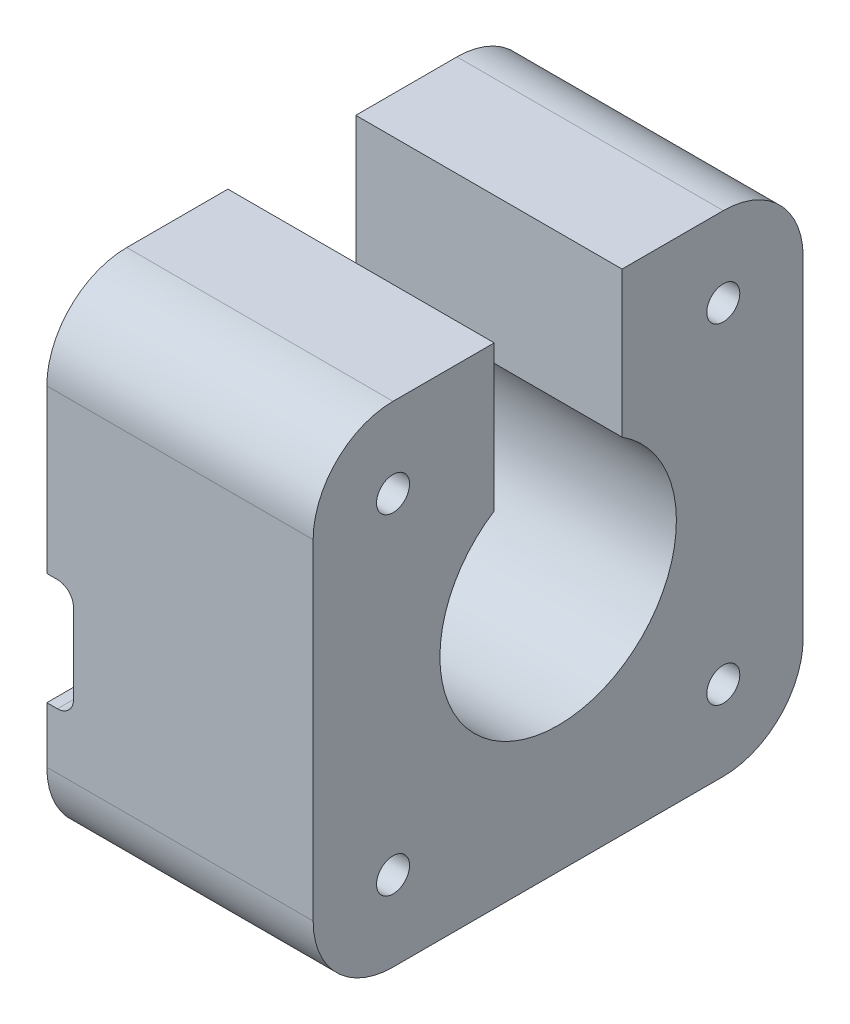
ISO-10303-21;
HEADER;
FILE_DESCRIPTION(('STEP AP214'),'2;1');
FILE_NAME('part.step','',(''),(''),'','','');
FILE_SCHEMA(('AUTOMOTIVE_DESIGN { 1 0 10303 214 1 1 1 1 }'));
ENDSEC;
DATA;
#1=APPLICATION_CONTEXT('core data for automotive mechanical design processes');
#2=APPLICATION_PROTOCOL_DEFINITION('international standard','automotive_design',2000,#1);
#3=PRODUCT_CONTEXT('',#1,'mechanical');
#4=PRODUCT('Part','Part','',(#3));
#5=PRODUCT_RELATED_PRODUCT_CATEGORY('part','',(#4));
#6=PRODUCT_DEFINITION_FORMATION('','',#4);
#7=PRODUCT_DEFINITION_CONTEXT('part definition',#1,'design');
#8=PRODUCT_DEFINITION('design','',#6,#7);
#9=PRODUCT_DEFINITION_SHAPE('','',#8);
#10=(LENGTH_UNIT() NAMED_UNIT(*) SI_UNIT(.MILLI.,.METRE.));
#11=(NAMED_UNIT(*) PLANE_ANGLE_UNIT() SI_UNIT($,.RADIAN.));
#12=(NAMED_UNIT(*) SI_UNIT($,.STERADIAN.) SOLID_ANGLE_UNIT());
#13=UNCERTAINTY_MEASURE_WITH_UNIT(LENGTH_MEASURE(1.E-05),#10,'distance_accuracy_value','');
#14=(GEOMETRIC_REPRESENTATION_CONTEXT(3) GLOBAL_UNCERTAINTY_ASSIGNED_CONTEXT((#13)) GLOBAL_UNIT_ASSIGNED_CONTEXT((#10,
#11,#12)) REPRESENTATION_CONTEXT('',''));
#15=CARTESIAN_POINT('',(0.,0.,0.));
#16=DIRECTION('',(0.,0.,1.));
#17=DIRECTION('',(1.,0.,0.));
#18=AXIS2_PLACEMENT_3D('',#15,#16,#17);
#19=CARTESIAN_POINT('',(0.,15.5,15.5));
#20=DIRECTION('',(1.,0.,0.));
#21=DIRECTION('',(0.,0.,-1.));
#22=AXIS2_PLACEMENT_3D('',#19,#20,#21);
#23=PLANE('',#22);
#24=CARTESIAN_POINT('',(0.,-15.5,-15.5));
#25=DIRECTION('',(1.,0.,0.));
#26=DIRECTION('',(0.,0.,-1.));
#27=AXIS2_PLACEMENT_3D('',#24,#25,#26);
#28=CIRCLE('',#27,1.55);
#29=CARTESIAN_POINT('',(0.,-15.5,-17.05));
#30=VERTEX_POINT('',#29);
#31=EDGE_CURVE('E409',#30,#30,#28,.T.);
#32=ORIENTED_EDGE('',*,*,#31,.T.);
#33=EDGE_LOOP('',(#32));
#34=FACE_BOUND('',#33,.T.);
#35=CARTESIAN_POINT('',(0.,-15.5,15.5));
#36=DIRECTION('',(1.,0.,0.));
#37=DIRECTION('',(0.,0.,-1.));
#38=AXIS2_PLACEMENT_3D('',#35,#36,#37);
#39=CIRCLE('',#38,1.55);
#40=CARTESIAN_POINT('',(0.,-15.5,13.95));
#41=VERTEX_POINT('',#40);
#42=EDGE_CURVE('E417',#41,#41,#39,.T.);
#43=ORIENTED_EDGE('',*,*,#42,.T.);
#44=EDGE_LOOP('',(#43));
#45=FACE_BOUND('',#44,.T.);
#46=DIRECTION('',(0.,-1.,0.));
#47=VECTOR('',#46,1.);
#48=CARTESIAN_POINT('',(0.,15.5,23.));
#49=LINE('',#48,#47);
#50=CARTESIAN_POINT('',(0.,-10.25,23.));
#51=VERTEX_POINT('',#50);
#52=CARTESIAN_POINT('',(0.,-15.5,23.));
#53=VERTEX_POINT('',#52);
#54=EDGE_CURVE('E230',#51,#53,#49,.T.);
#55=ORIENTED_EDGE('',*,*,#54,.F.);
#56=DIRECTION('',(0.,0.,-1.));
#57=VECTOR('',#56,1.);
#58=CARTESIAN_POINT('',(0.,-10.25,23.));
#59=LINE('',#58,#57);
#60=CARTESIAN_POINT('',(0.,-10.25,4.25998826289473));
#61=VERTEX_POINT('',#60);
#62=EDGE_CURVE('E444',#51,#61,#59,.T.);
#63=ORIENTED_EDGE('',*,*,#62,.T.);
#64=CARTESIAN_POINT('',(0.,0.,0.));
#65=DIRECTION('',(1.,0.,0.));
#66=DIRECTION('',(0.,0.,-1.));
#67=AXIS2_PLACEMENT_3D('',#64,#65,#66);
#68=CIRCLE('',#67,11.1);
#69=CARTESIAN_POINT('',(0.,-10.25,-4.25998826289473));
#70=VERTEX_POINT('',#69);
#71=EDGE_CURVE('E379',#61,#70,#68,.T.);
#72=ORIENTED_EDGE('',*,*,#71,.T.);
#73=CARTESIAN_POINT('',(0.,-10.25,-23.));
#74=VERTEX_POINT('',#73);
#75=EDGE_CURVE('E465',#70,#74,#59,.T.);
#76=ORIENTED_EDGE('',*,*,#75,.T.);
#77=DIRECTION('',(0.,1.,0.));
#78=VECTOR('',#77,1.);
#79=CARTESIAN_POINT('',(0.,-15.5,-23.));
#80=LINE('',#79,#78);
#81=CARTESIAN_POINT('',(0.,-15.5,-23.));
#82=VERTEX_POINT('',#81);
#83=EDGE_CURVE('E246',#82,#74,#80,.T.);
#84=ORIENTED_EDGE('',*,*,#83,.F.);
#85=CARTESIAN_POINT('',(0.,-15.5,-15.5));
#86=DIRECTION('',(1.,0.,0.));
#87=DIRECTION('',(0.,0.,-1.));
#88=AXIS2_PLACEMENT_3D('',#85,#86,#87);
#89=CIRCLE('',#88,7.5);
#90=CARTESIAN_POINT('',(0.,-23.,-15.5));
#91=VERTEX_POINT('',#90);
#92=EDGE_CURVE('E242',#91,#82,#89,.T.);
#93=ORIENTED_EDGE('',*,*,#92,.F.);
#94=DIRECTION('',(0.,0.,-1.));
#95=VECTOR('',#94,1.);
#96=CARTESIAN_POINT('',(0.,-23.,15.5));
#97=LINE('',#96,#95);
#98=CARTESIAN_POINT('',(0.,-23.,15.5));
#99=VERTEX_POINT('',#98);
#100=EDGE_CURVE('E234',#99,#91,#97,.T.);
#101=ORIENTED_EDGE('',*,*,#100,.F.);
#102=CARTESIAN_POINT('',(0.,-15.5,15.5));
#103=DIRECTION('',(1.,0.,0.));
#104=DIRECTION('',(0.,0.,-1.));
#105=AXIS2_PLACEMENT_3D('',#102,#103,#104);
#106=CIRCLE('',#105,7.5);
#107=EDGE_CURVE('E229',#53,#99,#106,.T.);
#108=ORIENTED_EDGE('',*,*,#107,.F.);
#109=EDGE_LOOP('',(#55,#63,#72,#76,#84,#93,#101,#108));
#110=FACE_BOUND('',#109,.T.);
#111=ADVANCED_FACE('F39',(#34,#45,#110),#23,.F.);
#112=CARTESIAN_POINT('',(0.,15.5,-15.5));
#113=DIRECTION('',(1.,0.,0.));
#114=DIRECTION('',(0.,0.,-1.));
#115=AXIS2_PLACEMENT_3D('',#112,#113,#114);
#116=CIRCLE('',#115,1.55);
#117=CARTESIAN_POINT('',(0.,15.5,-17.05));
#118=VERTEX_POINT('',#117);
#119=EDGE_CURVE('E401',#118,#118,#116,.T.);
#120=ORIENTED_EDGE('',*,*,#119,.T.);
#121=EDGE_LOOP('',(#120));
#122=FACE_BOUND('',#121,.T.);
#123=CARTESIAN_POINT('',(0.,0.25,-23.));
#124=VERTEX_POINT('',#123);
#125=CARTESIAN_POINT('',(0.,15.5,-23.));
#126=VERTEX_POINT('',#125);
#127=EDGE_CURVE('E245',#124,#126,#80,.T.);
#128=ORIENTED_EDGE('',*,*,#127,.F.);
#129=DIRECTION('',(0.,0.,-1.));
#130=VECTOR('',#129,1.);
#131=CARTESIAN_POINT('',(0.,0.25,23.));
#132=LINE('',#131,#130);
#133=CARTESIAN_POINT('',(0.,0.25,-11.0971843275671));
#134=VERTEX_POINT('',#133);
#135=EDGE_CURVE('E221',#134,#124,#132,.T.);
#136=ORIENTED_EDGE('',*,*,#135,.F.);
#137=CARTESIAN_POINT('',(0.,9.33862944976403,-6.));
#138=VERTEX_POINT('',#137);
#139=EDGE_CURVE('E369',#134,#138,#68,.T.);
#140=ORIENTED_EDGE('',*,*,#139,.T.);
#141=DIRECTION('',(0.,1.,0.));
#142=VECTOR('',#141,1.);
#143=CARTESIAN_POINT('',(0.,23.,-6.));
#144=LINE('',#143,#142);
#145=CARTESIAN_POINT('',(0.,23.,-6.));
#146=VERTEX_POINT('',#145);
#147=EDGE_CURVE('E429',#138,#146,#144,.T.);
#148=ORIENTED_EDGE('',*,*,#147,.T.);
#149=DIRECTION('',(0.,0.,1.));
#150=VECTOR('',#149,1.);
#151=CARTESIAN_POINT('',(0.,23.,15.5));
#152=LINE('',#151,#150);
#153=CARTESIAN_POINT('',(0.,23.,-15.5));
#154=VERTEX_POINT('',#153);
#155=EDGE_CURVE('E254',#154,#146,#152,.T.);
#156=ORIENTED_EDGE('',*,*,#155,.F.);
#157=CARTESIAN_POINT('',(0.,15.5,-15.5));
#158=DIRECTION('',(1.,0.,0.));
#159=DIRECTION('',(0.,0.,-1.));
#160=AXIS2_PLACEMENT_3D('',#157,#158,#159);
#161=CIRCLE('',#160,7.5);
#162=EDGE_CURVE('E250',#126,#154,#161,.T.);
#163=ORIENTED_EDGE('',*,*,#162,.F.);
#164=EDGE_LOOP('',(#128,#136,#140,#148,#156,#163));
#165=FACE_BOUND('',#164,.T.);
#166=ADVANCED_FACE('F367',(#122,#165),#23,.F.);
#167=CARTESIAN_POINT('',(25.,23.,15.5));
#168=DIRECTION('',(0.,-1.,0.));
#169=DIRECTION('',(0.,0.,-1.));
#170=AXIS2_PLACEMENT_3D('',#167,#168,#169);
#171=PLANE('',#170);
#172=ORIENTED_EDGE('',*,*,#155,.T.);
#173=DIRECTION('',(1.,0.,0.));
#174=VECTOR('',#173,1.);
#175=CARTESIAN_POINT('',(0.,23.,-6.));
#176=LINE('',#175,#174);
#177=CARTESIAN_POINT('',(25.,23.,-6.));
#178=VERTEX_POINT('',#177);
#179=EDGE_CURVE('E421',#146,#178,#176,.T.);
#180=ORIENTED_EDGE('',*,*,#179,.T.);
#181=DIRECTION('',(0.,0.,1.));
#182=VECTOR('',#181,1.);
#183=CARTESIAN_POINT('',(25.,23.,15.5));
#184=LINE('',#183,#182);
#185=CARTESIAN_POINT('',(25.,23.,-15.5));
#186=VERTEX_POINT('',#185);
#187=EDGE_CURVE('E264',#186,#178,#184,.T.);
#188=ORIENTED_EDGE('',*,*,#187,.F.);
#189=DIRECTION('',(-1.,0.,0.));
#190=VECTOR('',#189,1.);
#191=CARTESIAN_POINT('',(25.,23.,-15.5));
#192=LINE('',#191,#190);
#193=EDGE_CURVE('E263',#186,#154,#192,.T.);
#194=ORIENTED_EDGE('',*,*,#193,.T.);
#195=EDGE_LOOP('',(#172,#180,#188,#194));
#196=FACE_BOUND('',#195,.T.);
#197=ADVANCED_FACE('F570',(#196),#171,.F.);
#198=CARTESIAN_POINT('',(25.,15.5,15.5));
#199=DIRECTION('',(1.,0.,0.));
#200=DIRECTION('',(0.,0.,-1.));
#201=AXIS2_PLACEMENT_3D('',#198,#199,#200);
#202=PLANE('',#201);
#203=DIRECTION('',(0.,1.,0.));
#204=VECTOR('',#203,1.);
#205=CARTESIAN_POINT('',(25.,23.,-6.));
#206=LINE('',#205,#204);
#207=CARTESIAN_POINT('',(25.,9.33862944976403,-6.));
#208=VERTEX_POINT('',#207);
#209=EDGE_CURVE('E437',#208,#178,#206,.T.);
#210=ORIENTED_EDGE('',*,*,#209,.F.);
#211=CARTESIAN_POINT('',(25.,0.,0.));
#212=DIRECTION('',(1.,0.,0.));
#213=DIRECTION('',(0.,0.,-1.));
#214=AXIS2_PLACEMENT_3D('',#211,#212,#213);
#215=CIRCLE('',#214,11.1);
#216=CARTESIAN_POINT('',(25.,9.33862944976403,6.));
#217=VERTEX_POINT('',#216);
#218=EDGE_CURVE('E391',#217,#208,#215,.T.);
#219=ORIENTED_EDGE('',*,*,#218,.F.);
#220=DIRECTION('',(0.,-1.,0.));
#221=VECTOR('',#220,1.);
#222=CARTESIAN_POINT('',(25.,23.,6.));
#223=LINE('',#222,#221);
#224=CARTESIAN_POINT('',(25.,23.,6.));
#225=VERTEX_POINT('',#224);
#226=EDGE_CURVE('E441',#225,#217,#223,.T.);
#227=ORIENTED_EDGE('',*,*,#226,.F.);
#228=CARTESIAN_POINT('',(25.,23.,15.5));
#229=VERTEX_POINT('',#228);
#230=EDGE_CURVE('E537',#225,#229,#184,.T.);
#231=ORIENTED_EDGE('',*,*,#230,.T.);
#232=CARTESIAN_POINT('',(25.,15.5,15.5));
#233=DIRECTION('',(1.,0.,0.));
#234=DIRECTION('',(0.,0.,-1.));
#235=AXIS2_PLACEMENT_3D('',#232,#233,#234);
#236=CIRCLE('',#235,7.5);
#237=CARTESIAN_POINT('',(25.,15.5,23.));
#238=VERTEX_POINT('',#237);
#239=EDGE_CURVE('E258',#229,#238,#236,.T.);
#240=ORIENTED_EDGE('',*,*,#239,.T.);
#241=DIRECTION('',(0.,-1.,0.));
#242=VECTOR('',#241,1.);
#243=CARTESIAN_POINT('',(25.,15.5,23.));
#244=LINE('',#243,#242);
#245=CARTESIAN_POINT('',(25.,-15.5,23.));
#246=VERTEX_POINT('',#245);
#247=EDGE_CURVE('E529',#238,#246,#244,.T.);
#248=ORIENTED_EDGE('',*,*,#247,.T.);
#249=CARTESIAN_POINT('',(25.,-15.5,15.5));
#250=DIRECTION('',(1.,0.,0.));
#251=DIRECTION('',(0.,0.,-1.));
#252=AXIS2_PLACEMENT_3D('',#249,#250,#251);
#253=CIRCLE('',#252,7.5);
#254=CARTESIAN_POINT('',(25.,-23.,15.5));
#255=VERTEX_POINT('',#254);
#256=EDGE_CURVE('E523',#246,#255,#253,.T.);
#257=ORIENTED_EDGE('',*,*,#256,.T.);
#258=DIRECTION('',(0.,0.,-1.));
#259=VECTOR('',#258,1.);
#260=CARTESIAN_POINT('',(25.,-23.,15.5));
#261=LINE('',#260,#259);
#262=CARTESIAN_POINT('',(25.,-23.,-15.5));
#263=VERTEX_POINT('',#262);
#264=EDGE_CURVE('E518',#255,#263,#261,.T.);
#265=ORIENTED_EDGE('',*,*,#264,.T.);
#266=CARTESIAN_POINT('',(25.,-15.5,-15.5));
#267=DIRECTION('',(1.,0.,0.));
#268=DIRECTION('',(0.,0.,-1.));
#269=AXIS2_PLACEMENT_3D('',#266,#267,#268);
#270=CIRCLE('',#269,7.5);
#271=CARTESIAN_POINT('',(25.,-15.5,-23.));
#272=VERTEX_POINT('',#271);
#273=EDGE_CURVE('E522',#263,#272,#270,.T.);
#274=ORIENTED_EDGE('',*,*,#273,.T.);
#275=DIRECTION('',(0.,1.,0.));
#276=VECTOR('',#275,1.);
#277=CARTESIAN_POINT('',(25.,-15.5,-23.));
#278=LINE('',#277,#276);
#279=CARTESIAN_POINT('',(25.,15.5,-23.));
#280=VERTEX_POINT('',#279);
#281=EDGE_CURVE('E527',#272,#280,#278,.T.);
#282=ORIENTED_EDGE('',*,*,#281,.T.);
#283=CARTESIAN_POINT('',(25.,15.5,-15.5));
#284=DIRECTION('',(1.,0.,0.));
#285=DIRECTION('',(0.,0.,-1.));
#286=AXIS2_PLACEMENT_3D('',#283,#284,#285);
#287=CIRCLE('',#286,7.5);
#288=EDGE_CURVE('E535',#280,#186,#287,.T.);
#289=ORIENTED_EDGE('',*,*,#288,.T.);
#290=ORIENTED_EDGE('',*,*,#187,.T.);
#291=EDGE_LOOP('',(#210,#219,#227,#231,#240,#248,#257,#265,#274,#282,#289,#290));
#292=FACE_BOUND('',#291,.T.);
#293=CARTESIAN_POINT('',(25.,-15.5,-15.5));
#294=DIRECTION('',(1.,0.,0.));
#295=DIRECTION('',(0.,0.,-1.));
#296=AXIS2_PLACEMENT_3D('',#293,#294,#295);
#297=CIRCLE('',#296,1.55);
#298=CARTESIAN_POINT('',(25.,-15.5,-17.05));
#299=VERTEX_POINT('',#298);
#300=EDGE_CURVE('E405',#299,#299,#297,.T.);
#301=ORIENTED_EDGE('',*,*,#300,.F.);
#302=EDGE_LOOP('',(#301));
#303=FACE_BOUND('',#302,.T.);
#304=CARTESIAN_POINT('',(25.,15.5,15.5));
#305=DIRECTION('',(1.,0.,0.));
#306=DIRECTION('',(0.,0.,-1.));
#307=AXIS2_PLACEMENT_3D('',#304,#305,#306);
#308=CIRCLE('',#307,1.55);
#309=CARTESIAN_POINT('',(25.,15.5,13.95));
#310=VERTEX_POINT('',#309);
#311=EDGE_CURVE('E380',#310,#310,#308,.T.);
#312=ORIENTED_EDGE('',*,*,#311,.F.);
#313=EDGE_LOOP('',(#312));
#314=FACE_BOUND('',#313,.T.);
#315=CARTESIAN_POINT('',(25.,15.5,-15.5));
#316=DIRECTION('',(1.,0.,0.));
#317=DIRECTION('',(0.,0.,-1.));
#318=AXIS2_PLACEMENT_3D('',#315,#316,#317);
#319=CIRCLE('',#318,1.55);
#320=CARTESIAN_POINT('',(25.,15.5,-17.05));
#321=VERTEX_POINT('',#320);
#322=EDGE_CURVE('E399',#321,#321,#319,.T.);
#323=ORIENTED_EDGE('',*,*,#322,.F.);
#324=EDGE_LOOP('',(#323));
#325=FACE_BOUND('',#324,.T.);
#326=CARTESIAN_POINT('',(25.,-15.5,15.5));
#327=DIRECTION('',(1.,0.,0.));
#328=DIRECTION('',(0.,0.,-1.));
#329=AXIS2_PLACEMENT_3D('',#326,#327,#328);
#330=CIRCLE('',#329,1.55);
#331=CARTESIAN_POINT('',(25.,-15.5,13.95));
#332=VERTEX_POINT('',#331);
#333=EDGE_CURVE('E413',#332,#332,#330,.T.);
#334=ORIENTED_EDGE('',*,*,#333,.F.);
#335=EDGE_LOOP('',(#334));
#336=FACE_BOUND('',#335,.T.);
#337=ADVANCED_FACE('F547',(#292,#303,#314,#325,#336),#202,.T.);
#338=CARTESIAN_POINT('',(0.,9.33862944976403,6.));
#339=VERTEX_POINT('',#338);
#340=CARTESIAN_POINT('',(0.,0.249999999999989,11.0971843275671));
#341=VERTEX_POINT('',#340);
#342=EDGE_CURVE('E219',#339,#341,#68,.T.);
#343=ORIENTED_EDGE('',*,*,#342,.T.);
#344=CARTESIAN_POINT('',(0.,0.25,23.));
#345=VERTEX_POINT('',#344);
#346=EDGE_CURVE('E63',#345,#341,#132,.T.);
#347=ORIENTED_EDGE('',*,*,#346,.F.);
#348=CARTESIAN_POINT('',(0.,15.5,23.));
#349=VERTEX_POINT('',#348);
#350=EDGE_CURVE('E215',#349,#345,#49,.T.);
#351=ORIENTED_EDGE('',*,*,#350,.F.);
#352=CARTESIAN_POINT('',(0.,15.5,15.5));
#353=DIRECTION('',(1.,0.,0.));
#354=DIRECTION('',(0.,0.,-1.));
#355=AXIS2_PLACEMENT_3D('',#352,#353,#354);
#356=CIRCLE('',#355,7.5);
#357=CARTESIAN_POINT('',(0.,23.,15.5));
#358=VERTEX_POINT('',#357);
#359=EDGE_CURVE('E236',#358,#349,#356,.T.);
#360=ORIENTED_EDGE('',*,*,#359,.F.);
#361=CARTESIAN_POINT('',(0.,23.,6.));
#362=VERTEX_POINT('',#361);
#363=EDGE_CURVE('E253',#362,#358,#152,.T.);
#364=ORIENTED_EDGE('',*,*,#363,.F.);
#365=DIRECTION('',(0.,-1.,0.));
#366=VECTOR('',#365,1.);
#367=CARTESIAN_POINT('',(0.,23.,6.));
#368=LINE('',#367,#366);
#369=EDGE_CURVE('E440',#362,#339,#368,.T.);
#370=ORIENTED_EDGE('',*,*,#369,.T.);
#371=EDGE_LOOP('',(#343,#347,#351,#360,#364,#370));
#372=FACE_BOUND('',#371,.T.);
#373=CARTESIAN_POINT('',(0.,15.5,15.5));
#374=DIRECTION('',(1.,0.,0.));
#375=DIRECTION('',(0.,0.,-1.));
#376=AXIS2_PLACEMENT_3D('',#373,#374,#375);
#377=CIRCLE('',#376,1.55);
#378=CARTESIAN_POINT('',(0.,15.5,13.95));
#379=VERTEX_POINT('',#378);
#380=EDGE_CURVE('E386',#379,#379,#377,.T.);
#381=ORIENTED_EDGE('',*,*,#380,.T.);
#382=EDGE_LOOP('',(#381));
#383=FACE_BOUND('',#382,.T.);
#384=ADVANCED_FACE('F212',(#372,#383),#23,.F.);
#385=CARTESIAN_POINT('',(25.,15.5,15.5));
#386=DIRECTION('',(-1.,0.,0.));
#387=DIRECTION('',(0.,0.,1.));
#388=AXIS2_PLACEMENT_3D('',#385,#386,#387);
#389=CYLINDRICAL_SURFACE('',#388,7.5);
#390=ORIENTED_EDGE('',*,*,#359,.T.);
#391=DIRECTION('',(-1.,0.,0.));
#392=VECTOR('',#391,1.);
#393=CARTESIAN_POINT('',(25.,15.5,23.));
#394=LINE('',#393,#392);
#395=EDGE_CURVE('E226',#238,#349,#394,.T.);
#396=ORIENTED_EDGE('',*,*,#395,.F.);
#397=ORIENTED_EDGE('',*,*,#239,.F.);
#398=DIRECTION('',(-1.,0.,0.));
#399=VECTOR('',#398,1.);
#400=CARTESIAN_POINT('',(25.,23.,15.5));
#401=LINE('',#400,#399);
#402=EDGE_CURVE('E259',#229,#358,#401,.T.);
#403=ORIENTED_EDGE('',*,*,#402,.T.);
#404=EDGE_LOOP('',(#390,#396,#397,#403));
#405=FACE_BOUND('',#404,.T.);
#406=ADVANCED_FACE('F41',(#405),#389,.T.);
#407=CARTESIAN_POINT('',(25.,15.5,23.));
#408=DIRECTION('',(0.,0.,-1.));
#409=DIRECTION('',(-1.,0.,0.));
#410=AXIS2_PLACEMENT_3D('',#407,#408,#409);
#411=PLANE('',#410);
#412=CARTESIAN_POINT('',(1.,-8.75,23.));
#413=DIRECTION('',(0.,0.,-1.));
#414=DIRECTION('',(-1.,0.,0.));
#415=AXIS2_PLACEMENT_3D('',#412,#413,#414);
#416=CIRCLE('',#415,1.5);
#417=CARTESIAN_POINT('',(2.5,-8.75,23.));
#418=VERTEX_POINT('',#417);
#419=CARTESIAN_POINT('',(1.,-10.25,23.));
#420=VERTEX_POINT('',#419);
#421=EDGE_CURVE('E488',#418,#420,#416,.T.);
#422=ORIENTED_EDGE('',*,*,#421,.T.);
#423=DIRECTION('',(-1.,0.,0.));
#424=VECTOR('',#423,1.);
#425=CARTESIAN_POINT('',(1.,-10.25,23.));
#426=LINE('',#425,#424);
#427=EDGE_CURVE('E373',#420,#51,#426,.T.);
#428=ORIENTED_EDGE('',*,*,#427,.T.);
#429=ORIENTED_EDGE('',*,*,#54,.T.);
#430=DIRECTION('',(-1.,0.,0.));
#431=VECTOR('',#430,1.);
#432=CARTESIAN_POINT('',(25.,-15.5,23.));
#433=LINE('',#432,#431);
#434=EDGE_CURVE('E284',#246,#53,#433,.T.);
#435=ORIENTED_EDGE('',*,*,#434,.F.);
#436=ORIENTED_EDGE('',*,*,#247,.F.);
#437=ORIENTED_EDGE('',*,*,#395,.T.);
#438=ORIENTED_EDGE('',*,*,#350,.T.);
#439=DIRECTION('',(1.,0.,0.));
#440=VECTOR('',#439,1.);
#441=CARTESIAN_POINT('',(0.,0.25,23.));
#442=LINE('',#441,#440);
#443=CARTESIAN_POINT('',(1.,0.25,23.));
#444=VERTEX_POINT('',#443);
#445=EDGE_CURVE('E198',#345,#444,#442,.T.);
#446=ORIENTED_EDGE('',*,*,#445,.T.);
#447=CARTESIAN_POINT('',(1.,-1.25,23.));
#448=DIRECTION('',(0.,0.,-1.));
#449=DIRECTION('',(-1.,0.,0.));
#450=AXIS2_PLACEMENT_3D('',#447,#448,#449);
#451=CIRCLE('',#450,1.5);
#452=CARTESIAN_POINT('',(2.5,-1.25,23.));
#453=VERTEX_POINT('',#452);
#454=EDGE_CURVE('E207',#444,#453,#451,.T.);
#455=ORIENTED_EDGE('',*,*,#454,.T.);
#456=DIRECTION('',(0.,-1.,0.));
#457=VECTOR('',#456,1.);
#458=CARTESIAN_POINT('',(2.5,-1.25,23.));
#459=LINE('',#458,#457);
#460=EDGE_CURVE('E491',#453,#418,#459,.T.);
#461=ORIENTED_EDGE('',*,*,#460,.T.);
#462=EDGE_LOOP('',(#422,#428,#429,#435,#436,#437,#438,#446,#455,#461));
#463=FACE_BOUND('',#462,.T.);
#464=ADVANCED_FACE('F224',(#463),#411,.F.);
#465=CARTESIAN_POINT('',(25.,-15.5,15.5));
#466=DIRECTION('',(-1.,0.,0.));
#467=DIRECTION('',(0.,0.,1.));
#468=AXIS2_PLACEMENT_3D('',#465,#466,#467);
#469=CYLINDRICAL_SURFACE('',#468,7.5);
#470=ORIENTED_EDGE('',*,*,#107,.T.);
#471=DIRECTION('',(-1.,0.,0.));
#472=VECTOR('',#471,1.);
#473=CARTESIAN_POINT('',(25.,-23.,15.5));
#474=LINE('',#473,#472);
#475=EDGE_CURVE('E280',#255,#99,#474,.T.);
#476=ORIENTED_EDGE('',*,*,#475,.F.);
#477=ORIENTED_EDGE('',*,*,#256,.F.);
#478=ORIENTED_EDGE('',*,*,#434,.T.);
#479=EDGE_LOOP('',(#470,#476,#477,#478));
#480=FACE_BOUND('',#479,.T.);
#481=ADVANCED_FACE('F512',(#480),#469,.T.);
#482=CARTESIAN_POINT('',(25.,-23.,15.5));
#483=DIRECTION('',(0.,1.,0.));
#484=DIRECTION('',(0.,0.,1.));
#485=AXIS2_PLACEMENT_3D('',#482,#483,#484);
#486=PLANE('',#485);
#487=ORIENTED_EDGE('',*,*,#100,.T.);
#488=DIRECTION('',(-1.,0.,0.));
#489=VECTOR('',#488,1.);
#490=CARTESIAN_POINT('',(25.,-23.,-15.5));
#491=LINE('',#490,#489);
#492=EDGE_CURVE('E276',#263,#91,#491,.T.);
#493=ORIENTED_EDGE('',*,*,#492,.F.);
#494=ORIENTED_EDGE('',*,*,#264,.F.);
#495=ORIENTED_EDGE('',*,*,#475,.T.);
#496=EDGE_LOOP('',(#487,#493,#494,#495));
#497=FACE_BOUND('',#496,.T.);
#498=ADVANCED_FACE('F516',(#497),#486,.F.);
#499=CARTESIAN_POINT('',(25.,-15.5,-15.5));
#500=DIRECTION('',(-1.,0.,0.));
#501=DIRECTION('',(0.,0.,1.));
#502=AXIS2_PLACEMENT_3D('',#499,#500,#501);
#503=CYLINDRICAL_SURFACE('',#502,7.5);
#504=ORIENTED_EDGE('',*,*,#92,.T.);
#505=DIRECTION('',(-1.,0.,0.));
#506=VECTOR('',#505,1.);
#507=CARTESIAN_POINT('',(25.,-15.5,-23.));
#508=LINE('',#507,#506);
#509=EDGE_CURVE('E272',#272,#82,#508,.T.);
#510=ORIENTED_EDGE('',*,*,#509,.F.);
#511=ORIENTED_EDGE('',*,*,#273,.F.);
#512=ORIENTED_EDGE('',*,*,#492,.T.);
#513=EDGE_LOOP('',(#504,#510,#511,#512));
#514=FACE_BOUND('',#513,.T.);
#515=ADVANCED_FACE('F611',(#514),#503,.T.);
#516=CARTESIAN_POINT('',(25.,-15.5,-23.));
#517=DIRECTION('',(0.,0.,1.));
#518=DIRECTION('',(1.,0.,0.));
#519=AXIS2_PLACEMENT_3D('',#516,#517,#518);
#520=PLANE('',#519);
#521=ORIENTED_EDGE('',*,*,#83,.T.);
#522=DIRECTION('',(-1.,0.,0.));
#523=VECTOR('',#522,1.);
#524=CARTESIAN_POINT('',(1.,-10.25,-23.));
#525=LINE('',#524,#523);
#526=CARTESIAN_POINT('',(1.,-10.25,-23.));
#527=VERTEX_POINT('',#526);
#528=EDGE_CURVE('E208',#527,#74,#525,.T.);
#529=ORIENTED_EDGE('',*,*,#528,.F.);
#530=CARTESIAN_POINT('',(1.,-8.75,-23.));
#531=DIRECTION('',(0.,0.,-1.));
#532=DIRECTION('',(-1.,0.,0.));
#533=AXIS2_PLACEMENT_3D('',#530,#531,#532);
#534=CIRCLE('',#533,1.5);
#535=CARTESIAN_POINT('',(2.5,-8.75,-23.));
#536=VERTEX_POINT('',#535);
#537=EDGE_CURVE('E470',#536,#527,#534,.T.);
#538=ORIENTED_EDGE('',*,*,#537,.F.);
#539=DIRECTION('',(0.,-1.,0.));
#540=VECTOR('',#539,1.);
#541=CARTESIAN_POINT('',(2.5,-1.25,-23.));
#542=LINE('',#541,#540);
#543=CARTESIAN_POINT('',(2.5,-1.25,-23.));
#544=VERTEX_POINT('',#543);
#545=EDGE_CURVE('E474',#544,#536,#542,.T.);
#546=ORIENTED_EDGE('',*,*,#545,.F.);
#547=CARTESIAN_POINT('',(1.,-1.25,-23.));
#548=DIRECTION('',(0.,0.,-1.));
#549=DIRECTION('',(-1.,0.,0.));
#550=AXIS2_PLACEMENT_3D('',#547,#548,#549);
#551=CIRCLE('',#550,1.5);
#552=CARTESIAN_POINT('',(1.,0.25,-23.));
#553=VERTEX_POINT('',#552);
#554=EDGE_CURVE('E478',#553,#544,#551,.T.);
#555=ORIENTED_EDGE('',*,*,#554,.F.);
#556=DIRECTION('',(1.,0.,0.));
#557=VECTOR('',#556,1.);
#558=CARTESIAN_POINT('',(0.,0.25,-23.));
#559=LINE('',#558,#557);
#560=EDGE_CURVE('E482',#124,#553,#559,.T.);
#561=ORIENTED_EDGE('',*,*,#560,.F.);
#562=ORIENTED_EDGE('',*,*,#127,.T.);
#563=DIRECTION('',(-1.,0.,0.));
#564=VECTOR('',#563,1.);
#565=CARTESIAN_POINT('',(25.,15.5,-23.));
#566=LINE('',#565,#564);
#567=EDGE_CURVE('E268',#280,#126,#566,.T.);
#568=ORIENTED_EDGE('',*,*,#567,.F.);
#569=ORIENTED_EDGE('',*,*,#281,.F.);
#570=ORIENTED_EDGE('',*,*,#509,.T.);
#571=EDGE_LOOP('',(#521,#529,#538,#546,#555,#561,#562,#568,#569,#570));
#572=FACE_BOUND('',#571,.T.);
#573=ADVANCED_FACE('F561',(#572),#520,.F.);
#574=CARTESIAN_POINT('',(25.,15.5,-15.5));
#575=DIRECTION('',(-1.,0.,0.));
#576=DIRECTION('',(0.,0.,1.));
#577=AXIS2_PLACEMENT_3D('',#574,#575,#576);
#578=CYLINDRICAL_SURFACE('',#577,7.5);
#579=ORIENTED_EDGE('',*,*,#162,.T.);
#580=ORIENTED_EDGE('',*,*,#193,.F.);
#581=ORIENTED_EDGE('',*,*,#288,.F.);
#582=ORIENTED_EDGE('',*,*,#567,.T.);
#583=EDGE_LOOP('',(#579,#580,#581,#582));
#584=FACE_BOUND('',#583,.T.);
#585=ADVANCED_FACE('F566',(#584),#578,.T.);
#586=ORIENTED_EDGE('',*,*,#230,.F.);
#587=DIRECTION('',(1.,0.,0.));
#588=VECTOR('',#587,1.);
#589=CARTESIAN_POINT('',(0.,23.,6.));
#590=LINE('',#589,#588);
#591=EDGE_CURVE('E425',#362,#225,#590,.T.);
#592=ORIENTED_EDGE('',*,*,#591,.F.);
#593=ORIENTED_EDGE('',*,*,#363,.T.);
#594=ORIENTED_EDGE('',*,*,#402,.F.);
#595=EDGE_LOOP('',(#586,#592,#593,#594));
#596=FACE_BOUND('',#595,.T.);
#597=ADVANCED_FACE('F552',(#596),#171,.F.);
#598=CARTESIAN_POINT('',(25.,0.,0.));
#599=DIRECTION('',(-1.,0.,0.));
#600=DIRECTION('',(0.,0.,1.));
#601=AXIS2_PLACEMENT_3D('',#598,#599,#600);
#602=CYLINDRICAL_SURFACE('',#601,11.1);
#603=DIRECTION('',(-1.,0.,0.));
#604=VECTOR('',#603,1.);
#605=CARTESIAN_POINT('',(25.,-10.25,-4.25998826289473));
#606=LINE('',#605,#604);
#607=CARTESIAN_POINT('',(1.,-10.25,-4.25998826289463));
#608=VERTEX_POINT('',#607);
#609=EDGE_CURVE('E11',#70,#608,#606,.F.);
#610=ORIENTED_EDGE('',*,*,#609,.F.);
#611=ORIENTED_EDGE('',*,*,#71,.F.);
#612=DIRECTION('',(-1.,0.,0.));
#613=VECTOR('',#612,1.);
#614=CARTESIAN_POINT('',(25.,-10.25,4.25998826289473));
#615=LINE('',#614,#613);
#616=CARTESIAN_POINT('',(1.,-10.25,4.25998826289463));
#617=VERTEX_POINT('',#616);
#618=EDGE_CURVE('E351',#617,#61,#615,.T.);
#619=ORIENTED_EDGE('',*,*,#618,.F.);
#620=CARTESIAN_POINT('',(2.5,-8.75,6.82989751021199));
#621=CARTESIAN_POINT('',(2.49999695216573,-8.78528515917654,6.78469354066598));
#622=CARTESIAN_POINT('',(2.49875532622525,-8.82021182246697,6.73922451309262));
#623=CARTESIAN_POINT('',(2.49392046342208,-8.88929144111668,6.64783992083634));
#624=CARTESIAN_POINT('',(2.49032771584265,-8.92344455592664,6.60192445101902));
#625=CARTESIAN_POINT('',(2.47621549913724,-9.02464246699139,6.46365705644471));
#626=CARTESIAN_POINT('',(2.4623617700818,-9.09046554190688,6.37073324625371));
#627=CARTESIAN_POINT('',(2.42629254340664,-9.21927325662786,6.18289042146512));
#628=CARTESIAN_POINT('',(2.40397856969152,-9.28221428524103,6.08796084926643));
#629=CARTESIAN_POINT('',(2.35145664945438,-9.40419911362212,5.8977787727638));
#630=CARTESIAN_POINT('',(2.32124888711603,-9.46324300428066,5.80252627604575));
#631=CARTESIAN_POINT('',(2.26022108950977,-9.56522344258651,5.63242047342988));
#632=CARTESIAN_POINT('',(2.23087154926326,-9.60893230057876,5.55749838165817));
#633=CARTESIAN_POINT('',(2.16715566359952,-9.69369508450005,5.40829279072307));
#634=CARTESIAN_POINT('',(2.13279017310511,-9.7347494611439,5.33400918501566));
#635=CARTESIAN_POINT('',(2.05883409098977,-9.81385570917713,5.18701909510774));
#636=CARTESIAN_POINT('',(2.01927085903877,-9.85192174103011,5.11430652656496));
#637=CARTESIAN_POINT('',(1.93407817540708,-9.92501206075216,4.97097430408308));
#638=CARTESIAN_POINT('',(1.88845409438628,-9.96003899672543,4.90035286412772));
#639=CARTESIAN_POINT('',(1.80412015481669,-10.016953740694,4.7826345884726));
#640=CARTESIAN_POINT('',(1.76723894880198,-10.0397073077964,4.73465201988863));
#641=CARTESIAN_POINT('',(1.68891330582348,-10.0831957837829,4.64131572466507));
#642=CARTESIAN_POINT('',(1.64745928347185,-10.1039262738317,4.59596783639556));
#643=CARTESIAN_POINT('',(1.55854528747562,-10.1429908245805,4.50910482665405));
#644=CARTESIAN_POINT('',(1.51102046079557,-10.1612938614913,4.46764100722024));
#645=CARTESIAN_POINT('',(1.40912533080726,-10.1941101213306,4.39224210856417));
#646=CARTESIAN_POINT('',(1.35478544305242,-10.2086393527371,4.35827532231768));
#647=CARTESIAN_POINT('',(1.26438910572748,-10.2268853873044,4.31521804802346));
#648=CARTESIAN_POINT('',(1.23082806955519,-10.2325454636162,4.30176135243941));
#649=CARTESIAN_POINT('',(1.16181524941657,-10.241648760836,4.28004328585147));
#650=CARTESIAN_POINT('',(1.12637003116729,-10.2450991952354,4.27176501169455));
#651=CARTESIAN_POINT('',(1.07549292511016,-10.2481745568072,4.26437838213682));
#652=CARTESIAN_POINT('',(1.06046378664187,-10.2488567722752,4.26273818967452));
#653=CARTESIAN_POINT('',(1.03029255957274,-10.249770127853,4.26054141657713));
#654=CARTESIAN_POINT('',(1.0151503449513,-10.250000651941,4.25998631580458));
#655=CARTESIAN_POINT('',(0.999999999999761,-10.2500000000001,4.25998826289634));
#656=B_SPLINE_CURVE_WITH_KNOTS('',3,(#620,#621,#622,#623,#624,#625,#626,#627,#628,#629,#630,
#631,#632,#633,#634,#635,#636,#637,#638,#639,#640,#641,#642,#643,#644,#645,#646,#647,#648,#649,
#650,#651,#652,#653,#654,#655),.UNSPECIFIED.,.F.,.F.,(4,2,2,2,2,2,2,2,2,2,2,2,2,2,2,2,2,4),(0.,
0.171999591995628,0.343963401166987,0.687697979288758,1.03556292967123,1.38341976413783,
1.65797192937961,1.93247735424332,2.20559177313197,2.47846577349229,2.672251114816,
2.86645067179867,3.06293231879775,3.25856635204477,3.3679896048114,3.47705379373688,
3.52241567534464,3.56783937904874),.UNSPECIFIED.);
#657=CARTESIAN_POINT('',(2.5,-8.75,6.82989751021199));
#658=VERTEX_POINT('',#657);
#659=EDGE_CURVE('E345',#658,#617,#656,.T.);
#660=ORIENTED_EDGE('',*,*,#659,.F.);
#661=CARTESIAN_POINT('',(2.5,0.,0.));
#662=DIRECTION('',(1.,0.,0.));
#663=DIRECTION('',(0.,0.,-1.));
#664=AXIS2_PLACEMENT_3D('',#661,#662,#663);
#665=CIRCLE('',#664,11.1);
#666=CARTESIAN_POINT('',(2.5,-1.25,11.0293925490029));
#667=VERTEX_POINT('',#666);
#668=EDGE_CURVE('E302',#667,#658,#665,.T.);
#669=ORIENTED_EDGE('',*,*,#668,.F.);
#670=CARTESIAN_POINT('',(1.,0.25,11.0971843275671));
#671=CARTESIAN_POINT('',(1.04220060914268,0.249999727878121,11.0971829460123));
#672=CARTESIAN_POINT('',(1.08438098532178,0.248217992844381,11.0972246288));
#673=CARTESIAN_POINT('',(1.16843968826563,0.241109976251942,11.0973818813861));
#674=CARTESIAN_POINT('',(1.21031803015039,0.235783873389023,11.0974974474596));
#675=CARTESIAN_POINT('',(1.33497680070952,0.214539701182118,11.0979361341235));
#676=CARTESIAN_POINT('',(1.41692192914977,0.193355627437189,11.0983513196999));
#677=CARTESIAN_POINT('',(1.57609010116996,0.137532416743666,11.0991826220091));
#678=CARTESIAN_POINT('',(1.65331088468049,0.102886897365642,11.0995987390904));
#679=CARTESIAN_POINT('',(1.80084068254252,0.0211259115116074,11.1000548803991));
#680=CARTESIAN_POINT('',(1.87115080156287,-0.0259875575038661,11.1000949648323));
#681=CARTESIAN_POINT('',(2.00284230414154,-0.131332387653525,11.0993476056332));
#682=CARTESIAN_POINT('',(2.0642260122222,-0.189560845171833,11.0985603778817));
#683=CARTESIAN_POINT('',(2.17634747309456,-0.315487913187399,11.0956939630473));
#684=CARTESIAN_POINT('',(2.22708386055367,-0.383187736368722,11.0936146104072));
#685=CARTESIAN_POINT('',(2.3163156085728,-0.525863116620007,11.0877655680937));
#686=CARTESIAN_POINT('',(2.35484769450033,-0.60081594170228,11.0840010336255));
#687=CARTESIAN_POINT('',(2.41879730958748,-0.755989674210383,11.0744979804946));
#688=CARTESIAN_POINT('',(2.44422147772146,-0.836207891534179,11.0687604635791));
#689=CARTESIAN_POINT('',(2.47515627056662,-0.972418132698317,11.0574593596341));
#690=CARTESIAN_POINT('',(2.48447443564116,-1.02762464445005,11.0524687657396));
#691=CARTESIAN_POINT('',(2.49689602495519,-1.13856377766776,11.0415944104597));
#692=CARTESIAN_POINT('',(2.5000084536153,-1.19429551880119,11.0357119565138));
#693=CARTESIAN_POINT('',(2.5,-1.25,11.0293925490029));
#694=B_SPLINE_CURVE_WITH_KNOTS('',3,(#670,#671,#672,#673,#674,#675,#676,#677,#678,#679,#680,
#681,#682,#683,#684,#685,#686,#687,#688,#689,#690,#691,#692,#693),.UNSPECIFIED.,.F.,.F.,(4,2,2,
2,2,2,2,2,2,2,2,4),(0.,0.126524026409575,0.253041674362418,0.505659489526935,0.758397223958112,
1.0110944923651,1.2637258377048,1.51638955882584,1.76828557329783,2.02005388036803,
2.18835112832694,2.3564040015435),.UNSPECIFIED.);
#695=CARTESIAN_POINT('',(1.,0.25,11.0971843275671));
#696=VERTEX_POINT('',#695);
#697=EDGE_CURVE('E293',#696,#667,#694,.T.);
#698=ORIENTED_EDGE('',*,*,#697,.F.);
#699=DIRECTION('',(-1.,0.,0.));
#700=VECTOR('',#699,1.);
#701=CARTESIAN_POINT('',(25.,0.249999999999989,11.0971843275671));
#702=LINE('',#701,#700);
#703=EDGE_CURVE('E290',#341,#696,#702,.F.);
#704=ORIENTED_EDGE('',*,*,#703,.F.);
#705=ORIENTED_EDGE('',*,*,#342,.F.);
#706=DIRECTION('',(1.,0.,0.));
#707=VECTOR('',#706,1.);
#708=CARTESIAN_POINT('',(0.,9.33862944976403,6.));
#709=LINE('',#708,#707);
#710=EDGE_CURVE('E428',#339,#217,#709,.T.);
#711=ORIENTED_EDGE('',*,*,#710,.T.);
#712=ORIENTED_EDGE('',*,*,#218,.T.);
#713=DIRECTION('',(1.,0.,0.));
#714=VECTOR('',#713,1.);
#715=CARTESIAN_POINT('',(0.,9.33862944976403,-6.));
#716=LINE('',#715,#714);
#717=EDGE_CURVE('E377',#138,#208,#716,.T.);
#718=ORIENTED_EDGE('',*,*,#717,.F.);
#719=ORIENTED_EDGE('',*,*,#139,.F.);
#720=DIRECTION('',(-1.,0.,0.));
#721=VECTOR('',#720,1.);
#722=CARTESIAN_POINT('',(25.,0.249999999999989,-11.0971843275671));
#723=LINE('',#722,#721);
#724=CARTESIAN_POINT('',(0.999999999999997,0.249999999999989,-11.0971843275671));
#725=VERTEX_POINT('',#724);
#726=EDGE_CURVE('E329',#725,#134,#723,.T.);
#727=ORIENTED_EDGE('',*,*,#726,.F.);
#728=CARTESIAN_POINT('',(2.5,-1.25,-11.0293925490029));
#729=CARTESIAN_POINT('',(2.49999979678307,-1.20822206162224,-11.0341286979443));
#730=CARTESIAN_POINT('',(2.49825342869667,-1.16643598886744,-11.0386224197701));
#731=CARTESIAN_POINT('',(2.49127337954302,-1.08310550598426,-11.0471096953993));
#732=CARTESIAN_POINT('',(2.48603972200213,-1.04156109422747,-11.0511032525768));
#733=CARTESIAN_POINT('',(2.46513826012706,-0.917812302641948,-11.0622985025399));
#734=CARTESIAN_POINT('',(2.44426991406796,-0.83635317582063,-11.0687304589418));
#735=CARTESIAN_POINT('',(2.38916601817644,-0.677928388581296,-11.0795640887791));
#736=CARTESIAN_POINT('',(2.35492136503784,-0.600965829415228,-11.0839643750926));
#737=CARTESIAN_POINT('',(2.27401010214389,-0.453793933431816,-11.0909647542321));
#738=CARTESIAN_POINT('',(2.22734623057774,-0.383583112630848,-11.0935652434228));
#739=CARTESIAN_POINT('',(2.12304267584168,-0.252101457722808,-11.09733165378));
#740=CARTESIAN_POINT('',(2.06543057104517,-0.190808829572137,-11.0985011257329));
#741=CARTESIAN_POINT('',(1.94076460002665,-0.0786798085682039,-11.099863135603));
#742=CARTESIAN_POINT('',(1.87370859566747,-0.0278457900180548,-11.1000554519217));
#743=CARTESIAN_POINT('',(1.73179694352402,0.0620817854890878,-11.0999181512733));
#744=CARTESIAN_POINT('',(1.65691327264865,0.101131070083629,-11.0995865946145));
#745=CARTESIAN_POINT('',(1.50167772128682,0.166117909926795,-11.0988047429576));
#746=CARTESIAN_POINT('',(1.42132881427999,0.192062531320567,-11.0983545121493));
#747=CARTESIAN_POINT('',(1.28378983520596,0.224018712048376,-11.0977467848076));
#748=CARTESIAN_POINT('',(1.22743646312374,0.233754436303155,-11.0975417139546));
#749=CARTESIAN_POINT('',(1.11406310936223,0.246745191889367,-11.0972576811579));
#750=CARTESIAN_POINT('',(1.05704410788262,0.250008777274014,-11.0971785527868));
#751=CARTESIAN_POINT('',(1.,0.25,-11.0971843275671));
#752=B_SPLINE_CURVE_WITH_KNOTS('',3,(#728,#729,#730,#731,#732,#733,#734,#735,#736,#737,#738,
#739,#740,#741,#742,#743,#744,#745,#746,#747,#748,#749,#750,#751),.UNSPECIFIED.,.F.,.F.,(4,2,2,
2,2,2,2,2,2,2,2,4),(0.,0.126060932803525,0.252121015168952,0.503826294433472,0.75570317215436,
1.00752456200285,1.2587198314442,1.50997206421357,1.7621567655046,2.01420534112176,
2.18542216422312,2.35641254340319),.UNSPECIFIED.);
#753=CARTESIAN_POINT('',(2.5,-1.25,-11.0293925490029));
#754=VERTEX_POINT('',#753);
#755=EDGE_CURVE('E321',#754,#725,#752,.T.);
#756=ORIENTED_EDGE('',*,*,#755,.F.);
#757=CARTESIAN_POINT('',(2.5,-8.75,-6.82989751021199));
#758=VERTEX_POINT('',#757);
#759=EDGE_CURVE('E328',#758,#754,#665,.T.);
#760=ORIENTED_EDGE('',*,*,#759,.F.);
#761=CARTESIAN_POINT('',(1.,-10.25,-4.25998826289463));
#762=CARTESIAN_POINT('',(1.03710990561362,-10.2500411564709,-4.25987571483697));
#763=CARTESIAN_POINT('',(1.07404661119869,-10.2486251333345,-4.26329721397663));
#764=CARTESIAN_POINT('',(1.14614980983656,-10.2432830880877,-4.27612294334296));
#765=CARTESIAN_POINT('',(1.18133419684342,-10.239393728829,-4.28543977576924));
#766=CARTESIAN_POINT('',(1.25951651963577,-10.2280561909525,-4.31243781933709));
#767=CARTESIAN_POINT('',(1.30182970651662,-10.2199039148995,-4.33175918891394));
#768=CARTESIAN_POINT('',(1.38281430066412,-10.2009286124723,-4.37626004697047));
#769=CARTESIAN_POINT('',(1.42146025373935,-10.1900885737802,-4.4014767900624));
#770=CARTESIAN_POINT('',(1.52392252001411,-10.1572233655411,-4.47700233424046));
#771=CARTESIAN_POINT('',(1.58387681021978,-10.1330660550607,-4.53154808739734));
#772=CARTESIAN_POINT('',(1.69506720494311,-10.0806587209899,-4.64697744393696));
#773=CARTESIAN_POINT('',(1.74628396924909,-10.0523998680491,-4.70787463832867));
#774=CARTESIAN_POINT('',(1.84543438185257,-9.99052141950233,-4.83787475720781));
#775=CARTESIAN_POINT('',(1.89285281505492,-9.95666078318322,-4.90725200902079));
#776=CARTESIAN_POINT('',(1.98138711155539,-9.88582180782202,-5.04844408242662));
#777=CARTESIAN_POINT('',(2.02249629411043,-9.84884022740042,-5.12026139083309));
#778=CARTESIAN_POINT('',(2.099297234455,-9.77200682508882,-5.26541918232213));
#779=CARTESIAN_POINT('',(2.13497957305254,-9.73215018585504,-5.33876206811748));
#780=CARTESIAN_POINT('',(2.20132372088248,-9.64978682766223,-5.48623297149923));
#781=CARTESIAN_POINT('',(2.23198460303349,-9.60727962134061,-5.56036113138243));
#782=CARTESIAN_POINT('',(2.29202929167211,-9.51426171252266,-5.71823686355192));
#783=CARTESIAN_POINT('',(2.32077503883051,-9.46341455718336,-5.80202925891016));
#784=CARTESIAN_POINT('',(2.37221600435514,-9.35862902825452,-5.96957535855766));
#785=CARTESIAN_POINT('',(2.39490939689068,-9.30468972779764,-6.05332904357958));
#786=CARTESIAN_POINT('',(2.43396414376206,-9.19404673741739,-6.22008732210761));
#787=CARTESIAN_POINT('',(2.45034557712194,-9.13735247045189,-6.30309345674711));
#788=CARTESIAN_POINT('',(2.47647607536284,-9.02121796307196,-6.46821500462384));
#789=CARTESIAN_POINT('',(2.48622717580734,-8.96177857142219,-6.55033068361233));
#790=CARTESIAN_POINT('',(2.49487918485069,-8.87631704375348,-6.66503709682694));
#791=CARTESIAN_POINT('',(2.49678630380787,-8.85132687500209,-6.69818915395006));
#792=CARTESIAN_POINT('',(2.49934631519747,-8.80095355721756,-6.764239881789));
#793=CARTESIAN_POINT('',(2.49999925508587,-8.77557042309018,-6.79713856204524));
#794=CARTESIAN_POINT('',(2.5,-8.75,-6.829897510212));
#795=B_SPLINE_CURVE_WITH_KNOTS('',3,(#761,#762,#763,#764,#765,#766,#767,#768,#769,#770,#771,
#772,#773,#774,#775,#776,#777,#778,#779,#780,#781,#782,#783,#784,#785,#786,#787,#788,#789,#790,
#791,#792,#793,#794),.UNSPECIFIED.,.F.,.F.,(4,2,2,2,2,2,2,2,2,2,2,2,2,2,2,2,4),(0.,
0.110867330856398,0.220128382784784,0.361002743746432,0.50279261638207,0.755108725620931,
1.00797627875722,1.27936450692349,1.55103814909024,1.82317807309307,2.09536818415587,
2.40156222613095,2.70784853430026,3.01315230623389,3.31836230517741,3.44302338454675,
3.56767974686148),.UNSPECIFIED.);
#796=EDGE_CURVE('E48',#608,#758,#795,.T.);
#797=ORIENTED_EDGE('',*,*,#796,.F.);
#798=EDGE_LOOP('',(#610,#611,#619,#660,#669,#698,#704,#705,#711,#712,#718,#719,#727,#756,#760,#797));
#799=FACE_BOUND('',#798,.T.);
#800=ADVANCED_FACE('F304',(#799),#602,.F.);
#801=CARTESIAN_POINT('',(25.,15.5,15.5));
#802=DIRECTION('',(-1.,0.,0.));
#803=DIRECTION('',(0.,0.,1.));
#804=AXIS2_PLACEMENT_3D('',#801,#802,#803);
#805=CYLINDRICAL_SURFACE('',#804,1.55);
#806=ORIENTED_EDGE('',*,*,#311,.T.);
#807=EDGE_LOOP('',(#806));
#808=FACE_BOUND('',#807,.T.);
#809=ORIENTED_EDGE('',*,*,#380,.F.);
#810=EDGE_LOOP('',(#809));
#811=FACE_BOUND('',#810,.T.);
#812=ADVANCED_FACE('F607',(#808,#811),#805,.F.);
#813=CARTESIAN_POINT('',(25.,15.5,-15.5));
#814=DIRECTION('',(-1.,0.,0.));
#815=DIRECTION('',(0.,0.,1.));
#816=AXIS2_PLACEMENT_3D('',#813,#814,#815);
#817=CYLINDRICAL_SURFACE('',#816,1.55);
#818=ORIENTED_EDGE('',*,*,#322,.T.);
#819=EDGE_LOOP('',(#818));
#820=FACE_BOUND('',#819,.T.);
#821=ORIENTED_EDGE('',*,*,#119,.F.);
#822=EDGE_LOOP('',(#821));
#823=FACE_BOUND('',#822,.T.);
#824=ADVANCED_FACE('F781',(#820,#823),#817,.F.);
#825=CARTESIAN_POINT('',(25.,-15.5,-15.5));
#826=DIRECTION('',(-1.,0.,0.));
#827=DIRECTION('',(0.,0.,1.));
#828=AXIS2_PLACEMENT_3D('',#825,#826,#827);
#829=CYLINDRICAL_SURFACE('',#828,1.55);
#830=ORIENTED_EDGE('',*,*,#300,.T.);
#831=EDGE_LOOP('',(#830));
#832=FACE_BOUND('',#831,.T.);
#833=ORIENTED_EDGE('',*,*,#31,.F.);
#834=EDGE_LOOP('',(#833));
#835=FACE_BOUND('',#834,.T.);
#836=ADVANCED_FACE('F772',(#832,#835),#829,.F.);
#837=CARTESIAN_POINT('',(25.,-15.5,15.5));
#838=DIRECTION('',(-1.,0.,0.));
#839=DIRECTION('',(0.,0.,1.));
#840=AXIS2_PLACEMENT_3D('',#837,#838,#839);
#841=CYLINDRICAL_SURFACE('',#840,1.55);
#842=ORIENTED_EDGE('',*,*,#333,.T.);
#843=EDGE_LOOP('',(#842));
#844=FACE_BOUND('',#843,.T.);
#845=ORIENTED_EDGE('',*,*,#42,.F.);
#846=EDGE_LOOP('',(#845));
#847=FACE_BOUND('',#846,.T.);
#848=ADVANCED_FACE('F579',(#844,#847),#841,.F.);
#849=CARTESIAN_POINT('',(0.,23.,6.));
#850=DIRECTION('',(0.,0.,1.));
#851=DIRECTION('',(0.,-1.,0.));
#852=AXIS2_PLACEMENT_3D('',#849,#850,#851);
#853=PLANE('',#852);
#854=ORIENTED_EDGE('',*,*,#226,.T.);
#855=ORIENTED_EDGE('',*,*,#710,.F.);
#856=ORIENTED_EDGE('',*,*,#369,.F.);
#857=ORIENTED_EDGE('',*,*,#591,.T.);
#858=EDGE_LOOP('',(#854,#855,#856,#857));
#859=FACE_BOUND('',#858,.T.);
#860=ADVANCED_FACE('F574',(#859),#853,.F.);
#861=CARTESIAN_POINT('',(0.,23.,-6.));
#862=DIRECTION('',(0.,0.,-1.));
#863=DIRECTION('',(-1.,0.,0.));
#864=AXIS2_PLACEMENT_3D('',#861,#862,#863);
#865=PLANE('',#864);
#866=ORIENTED_EDGE('',*,*,#209,.T.);
#867=ORIENTED_EDGE('',*,*,#179,.F.);
#868=ORIENTED_EDGE('',*,*,#147,.F.);
#869=ORIENTED_EDGE('',*,*,#717,.T.);
#870=EDGE_LOOP('',(#866,#867,#868,#869));
#871=FACE_BOUND('',#870,.T.);
#872=ADVANCED_FACE('F572',(#871),#865,.F.);
#873=CARTESIAN_POINT('',(0.,0.25,23.));
#874=DIRECTION('',(0.,1.,0.));
#875=DIRECTION('',(-1.,0.,0.));
#876=AXIS2_PLACEMENT_3D('',#873,#874,#875);
#877=PLANE('',#876);
#878=ORIENTED_EDGE('',*,*,#703,.T.);
#879=DIRECTION('',(0.,0.,-1.));
#880=VECTOR('',#879,1.);
#881=CARTESIAN_POINT('',(1.,0.25,23.));
#882=LINE('',#881,#880);
#883=EDGE_CURVE('E201',#444,#696,#882,.T.);
#884=ORIENTED_EDGE('',*,*,#883,.F.);
#885=ORIENTED_EDGE('',*,*,#445,.F.);
#886=ORIENTED_EDGE('',*,*,#346,.T.);
#887=EDGE_LOOP('',(#878,#884,#885,#886));
#888=FACE_BOUND('',#887,.T.);
#889=ADVANCED_FACE('F199',(#888),#877,.F.);
#890=CARTESIAN_POINT('',(1.,-1.25,23.));
#891=DIRECTION('',(0.,0.,-1.));
#892=DIRECTION('',(-1.,0.,0.));
#893=AXIS2_PLACEMENT_3D('',#890,#891,#892);
#894=CYLINDRICAL_SURFACE('',#893,1.5);
#895=ORIENTED_EDGE('',*,*,#697,.T.);
#896=DIRECTION('',(0.,0.,-1.));
#897=VECTOR('',#896,1.);
#898=CARTESIAN_POINT('',(2.5,-1.25,23.));
#899=LINE('',#898,#897);
#900=EDGE_CURVE('E452',#453,#667,#899,.T.);
#901=ORIENTED_EDGE('',*,*,#900,.F.);
#902=ORIENTED_EDGE('',*,*,#454,.F.);
#903=ORIENTED_EDGE('',*,*,#883,.T.);
#904=EDGE_LOOP('',(#895,#901,#902,#903));
#905=FACE_BOUND('',#904,.T.);
#906=ADVANCED_FACE('F308',(#905),#894,.F.);
#907=CARTESIAN_POINT('',(2.5,-1.25,23.));
#908=DIRECTION('',(1.,0.,0.));
#909=DIRECTION('',(0.,0.,-1.));
#910=AXIS2_PLACEMENT_3D('',#907,#908,#909);
#911=PLANE('',#910);
#912=ORIENTED_EDGE('',*,*,#668,.T.);
#913=DIRECTION('',(0.,0.,-1.));
#914=VECTOR('',#913,1.);
#915=CARTESIAN_POINT('',(2.5,-8.75,23.));
#916=LINE('',#915,#914);
#917=EDGE_CURVE('E457',#418,#658,#916,.T.);
#918=ORIENTED_EDGE('',*,*,#917,.F.);
#919=ORIENTED_EDGE('',*,*,#460,.F.);
#920=ORIENTED_EDGE('',*,*,#900,.T.);
#921=EDGE_LOOP('',(#912,#918,#919,#920));
#922=FACE_BOUND('',#921,.T.);
#923=ADVANCED_FACE('F313',(#922),#911,.F.);
#924=CARTESIAN_POINT('',(1.,-8.75,23.));
#925=DIRECTION('',(0.,0.,-1.));
#926=DIRECTION('',(-1.,0.,0.));
#927=AXIS2_PLACEMENT_3D('',#924,#925,#926);
#928=CYLINDRICAL_SURFACE('',#927,1.5);
#929=ORIENTED_EDGE('',*,*,#659,.T.);
#930=DIRECTION('',(0.,0.,-1.));
#931=VECTOR('',#930,1.);
#932=CARTESIAN_POINT('',(1.,-10.25,23.));
#933=LINE('',#932,#931);
#934=EDGE_CURVE('E462',#420,#617,#933,.T.);
#935=ORIENTED_EDGE('',*,*,#934,.F.);
#936=ORIENTED_EDGE('',*,*,#421,.F.);
#937=ORIENTED_EDGE('',*,*,#917,.T.);
#938=EDGE_LOOP('',(#929,#935,#936,#937));
#939=FACE_BOUND('',#938,.T.);
#940=ADVANCED_FACE('F336',(#939),#928,.F.);
#941=CARTESIAN_POINT('',(1.,-10.25,23.));
#942=DIRECTION('',(0.,-1.,0.));
#943=DIRECTION('',(1.,0.,0.));
#944=AXIS2_PLACEMENT_3D('',#941,#942,#943);
#945=PLANE('',#944);
#946=ORIENTED_EDGE('',*,*,#618,.T.);
#947=ORIENTED_EDGE('',*,*,#62,.F.);
#948=ORIENTED_EDGE('',*,*,#427,.F.);
#949=ORIENTED_EDGE('',*,*,#934,.T.);
#950=EDGE_LOOP('',(#946,#947,#948,#949));
#951=FACE_BOUND('',#950,.T.);
#952=ADVANCED_FACE('F340',(#951),#945,.F.);
#953=ORIENTED_EDGE('',*,*,#796,.T.);
#954=EDGE_CURVE('E456',#758,#536,#916,.T.);
#955=ORIENTED_EDGE('',*,*,#954,.T.);
#956=ORIENTED_EDGE('',*,*,#537,.T.);
#957=EDGE_CURVE('E461',#608,#527,#933,.T.);
#958=ORIENTED_EDGE('',*,*,#957,.F.);
#959=EDGE_LOOP('',(#953,#955,#956,#958));
#960=FACE_BOUND('',#959,.T.);
#961=ADVANCED_FACE('F342',(#960),#928,.F.);
#962=ORIENTED_EDGE('',*,*,#755,.T.);
#963=EDGE_CURVE('E55',#725,#553,#882,.T.);
#964=ORIENTED_EDGE('',*,*,#963,.T.);
#965=ORIENTED_EDGE('',*,*,#554,.T.);
#966=EDGE_CURVE('E451',#754,#544,#899,.T.);
#967=ORIENTED_EDGE('',*,*,#966,.F.);
#968=EDGE_LOOP('',(#962,#964,#965,#967));
#969=FACE_BOUND('',#968,.T.);
#970=ADVANCED_FACE('F315',(#969),#894,.F.);
#971=ORIENTED_EDGE('',*,*,#726,.T.);
#972=ORIENTED_EDGE('',*,*,#135,.T.);
#973=ORIENTED_EDGE('',*,*,#560,.T.);
#974=ORIENTED_EDGE('',*,*,#963,.F.);
#975=EDGE_LOOP('',(#971,#972,#973,#974));
#976=FACE_BOUND('',#975,.T.);
#977=ADVANCED_FACE('F360',(#976),#877,.F.);
#978=ORIENTED_EDGE('',*,*,#609,.T.);
#979=ORIENTED_EDGE('',*,*,#957,.T.);
#980=ORIENTED_EDGE('',*,*,#528,.T.);
#981=ORIENTED_EDGE('',*,*,#75,.F.);
#982=EDGE_LOOP('',(#978,#979,#980,#981));
#983=FACE_BOUND('',#982,.T.);
#984=ADVANCED_FACE('F343',(#983),#945,.F.);
#985=ORIENTED_EDGE('',*,*,#759,.T.);
#986=ORIENTED_EDGE('',*,*,#966,.T.);
#987=ORIENTED_EDGE('',*,*,#545,.T.);
#988=ORIENTED_EDGE('',*,*,#954,.F.);
#989=EDGE_LOOP('',(#985,#986,#987,#988));
#990=FACE_BOUND('',#989,.T.);
#991=ADVANCED_FACE('F316',(#990),#911,.F.);
#992=CLOSED_SHELL('',(#111,#166,#197,#337,#384,#406,#464,#481,#498,#515,#573,#585,#597,#800,
#812,#824,#836,#848,#860,#872,#889,#906,#923,#940,#952,#961,#970,#977,#984,#991));
#993=MANIFOLD_SOLID_BREP('B2',#992);
#994=ADVANCED_BREP_SHAPE_REPRESENTATION('',(#18,#993),#14);
#995=SHAPE_DEFINITION_REPRESENTATION(#9,#994);
ENDSEC;
END-ISO-10303-21;
